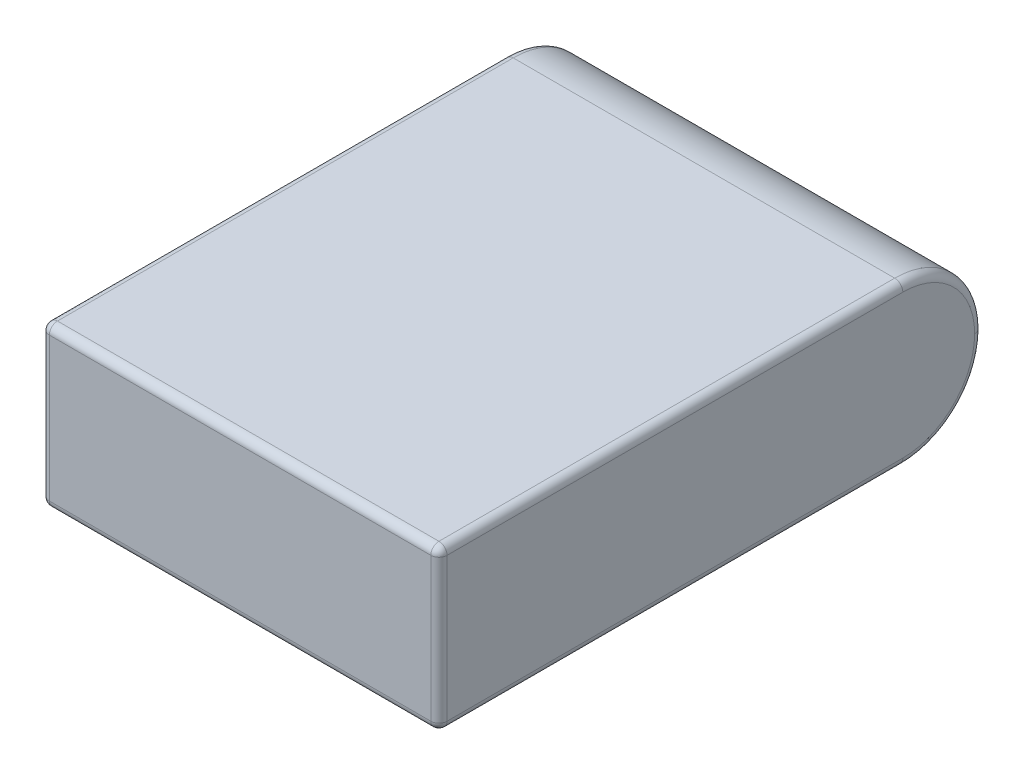
ISO-10303-21;
HEADER;
FILE_DESCRIPTION(('STEP AP214'),'2;1');
FILE_NAME('part.step','',(''),(''),'','','');
FILE_SCHEMA(('AUTOMOTIVE_DESIGN { 1 0 10303 214 1 1 1 1 }'));
ENDSEC;
DATA;
#1=APPLICATION_CONTEXT('core data for automotive mechanical design processes');
#2=APPLICATION_PROTOCOL_DEFINITION('international standard','automotive_design',2000,#1);
#3=PRODUCT_CONTEXT('',#1,'mechanical');
#4=PRODUCT('Part','Part','',(#3));
#5=PRODUCT_RELATED_PRODUCT_CATEGORY('part','',(#4));
#6=PRODUCT_DEFINITION_FORMATION('','',#4);
#7=PRODUCT_DEFINITION_CONTEXT('part definition',#1,'design');
#8=PRODUCT_DEFINITION('design','',#6,#7);
#9=PRODUCT_DEFINITION_SHAPE('','',#8);
#10=(LENGTH_UNIT() NAMED_UNIT(*) SI_UNIT(.MILLI.,.METRE.));
#11=(NAMED_UNIT(*) PLANE_ANGLE_UNIT() SI_UNIT($,.RADIAN.));
#12=(NAMED_UNIT(*) SI_UNIT($,.STERADIAN.) SOLID_ANGLE_UNIT());
#13=UNCERTAINTY_MEASURE_WITH_UNIT(LENGTH_MEASURE(1.E-05),#10,'distance_accuracy_value','');
#14=(GEOMETRIC_REPRESENTATION_CONTEXT(3) GLOBAL_UNCERTAINTY_ASSIGNED_CONTEXT((#13)) GLOBAL_UNIT_ASSIGNED_CONTEXT((#10,
#11,#12)) REPRESENTATION_CONTEXT('',''));
#15=CARTESIAN_POINT('',(0.,0.,0.));
#16=DIRECTION('',(0.,0.,1.));
#17=DIRECTION('',(1.,0.,0.));
#18=AXIS2_PLACEMENT_3D('',#15,#16,#17);
#19=CARTESIAN_POINT('',(24.5,-19.7,-33.5));
#20=DIRECTION('',(1.,0.,0.));
#21=DIRECTION('',(0.,0.,-1.));
#22=AXIS2_PLACEMENT_3D('',#19,#20,#21);
#23=PLANE('',#22);
#24=DIRECTION('',(0.,0.,-1.));
#25=VECTOR('',#24,1.);
#26=CARTESIAN_POINT('',(24.5,-1.,-33.5));
#27=LINE('',#26,#25);
#28=CARTESIAN_POINT('',(24.5,-1.,-23.65));
#29=VERTEX_POINT('',#28);
#30=CARTESIAN_POINT('',(24.5,-1.,32.5));
#31=VERTEX_POINT('',#30);
#32=EDGE_CURVE('E167',#29,#31,#27,.F.);
#33=ORIENTED_EDGE('',*,*,#32,.T.);
#34=DIRECTION('',(0.,1.,0.));
#35=VECTOR('',#34,1.);
#36=CARTESIAN_POINT('',(24.5,-19.7,32.5));
#37=LINE('',#36,#35);
#38=CARTESIAN_POINT('',(24.5,-18.7,32.5));
#39=VERTEX_POINT('',#38);
#40=EDGE_CURVE('E128',#31,#39,#37,.F.);
#41=ORIENTED_EDGE('',*,*,#40,.T.);
#42=DIRECTION('',(0.,0.,-1.));
#43=VECTOR('',#42,1.);
#44=CARTESIAN_POINT('',(24.5,-18.7,-23.65));
#45=LINE('',#44,#43);
#46=CARTESIAN_POINT('',(24.5,-18.7,-23.65));
#47=VERTEX_POINT('',#46);
#48=EDGE_CURVE('E158',#39,#47,#45,.T.);
#49=ORIENTED_EDGE('',*,*,#48,.T.);
#50=CARTESIAN_POINT('',(24.5,-9.85,-23.65));
#51=DIRECTION('',(1.,0.,0.));
#52=DIRECTION('',(0.,0.,-1.));
#53=AXIS2_PLACEMENT_3D('',#50,#51,#52);
#54=CIRCLE('',#53,8.85);
#55=CARTESIAN_POINT('',(24.5,-9.85,-32.5));
#56=VERTEX_POINT('',#55);
#57=EDGE_CURVE('E163',#47,#56,#54,.T.);
#58=ORIENTED_EDGE('',*,*,#57,.T.);
#59=CARTESIAN_POINT('',(24.5,-9.85,-23.65));
#60=DIRECTION('',(1.,0.,0.));
#61=DIRECTION('',(0.,0.,-1.));
#62=AXIS2_PLACEMENT_3D('',#59,#60,#61);
#63=CIRCLE('',#62,8.85);
#64=EDGE_CURVE('E165',#56,#29,#63,.T.);
#65=ORIENTED_EDGE('',*,*,#64,.T.);
#66=EDGE_LOOP('',(#33,#41,#49,#58,#65));
#67=FACE_BOUND('',#66,.T.);
#68=ADVANCED_FACE('F33',(#67),#23,.T.);
#69=CARTESIAN_POINT('',(-24.5,-19.7,33.5));
#70=DIRECTION('',(0.,0.,1.));
#71=DIRECTION('',(1.,0.,0.));
#72=AXIS2_PLACEMENT_3D('',#69,#70,#71);
#73=PLANE('',#72);
#74=DIRECTION('',(0.,1.,0.));
#75=VECTOR('',#74,1.);
#76=CARTESIAN_POINT('',(-23.5,-19.7,33.5));
#77=LINE('',#76,#75);
#78=CARTESIAN_POINT('',(-23.5,-1.,33.5));
#79=VERTEX_POINT('',#78);
#80=CARTESIAN_POINT('',(-23.5,-18.7,33.5));
#81=VERTEX_POINT('',#80);
#82=EDGE_CURVE('E150',#79,#81,#77,.F.);
#83=ORIENTED_EDGE('',*,*,#82,.T.);
#84=DIRECTION('',(1.,0.,0.));
#85=VECTOR('',#84,1.);
#86=CARTESIAN_POINT('',(24.5,-18.7,33.5));
#87=LINE('',#86,#85);
#88=CARTESIAN_POINT('',(23.5,-18.7,33.5));
#89=VERTEX_POINT('',#88);
#90=EDGE_CURVE('E155',#81,#89,#87,.T.);
#91=ORIENTED_EDGE('',*,*,#90,.T.);
#92=DIRECTION('',(0.,1.,0.));
#93=VECTOR('',#92,1.);
#94=CARTESIAN_POINT('',(23.5,-19.7,33.5));
#95=LINE('',#94,#93);
#96=CARTESIAN_POINT('',(23.5,-1.,33.5));
#97=VERTEX_POINT('',#96);
#98=EDGE_CURVE('E126',#89,#97,#95,.T.);
#99=ORIENTED_EDGE('',*,*,#98,.T.);
#100=DIRECTION('',(1.,0.,0.));
#101=VECTOR('',#100,1.);
#102=CARTESIAN_POINT('',(-24.5,-1.,33.5));
#103=LINE('',#102,#101);
#104=EDGE_CURVE('E144',#97,#79,#103,.F.);
#105=ORIENTED_EDGE('',*,*,#104,.T.);
#106=EDGE_LOOP('',(#83,#91,#99,#105));
#107=FACE_BOUND('',#106,.T.);
#108=ADVANCED_FACE('F153',(#107),#73,.T.);
#109=CARTESIAN_POINT('',(-24.5,-19.7,-33.5));
#110=DIRECTION('',(-1.,0.,0.));
#111=DIRECTION('',(0.,0.,1.));
#112=AXIS2_PLACEMENT_3D('',#109,#110,#111);
#113=PLANE('',#112);
#114=DIRECTION('',(0.,1.,0.));
#115=VECTOR('',#114,1.);
#116=CARTESIAN_POINT('',(-24.5,-19.7,32.5));
#117=LINE('',#116,#115);
#118=CARTESIAN_POINT('',(-24.5,-18.7,32.5));
#119=VERTEX_POINT('',#118);
#120=CARTESIAN_POINT('',(-24.5,-1.,32.5));
#121=VERTEX_POINT('',#120);
#122=EDGE_CURVE('E42',#119,#121,#117,.T.);
#123=ORIENTED_EDGE('',*,*,#122,.T.);
#124=DIRECTION('',(0.,0.,1.));
#125=VECTOR('',#124,1.);
#126=CARTESIAN_POINT('',(-24.5,-1.,-33.5));
#127=LINE('',#126,#125);
#128=CARTESIAN_POINT('',(-24.5,-1.,-23.65));
#129=VERTEX_POINT('',#128);
#130=EDGE_CURVE('E11',#121,#129,#127,.F.);
#131=ORIENTED_EDGE('',*,*,#130,.T.);
#132=CARTESIAN_POINT('',(-24.5,-9.85,-23.65));
#133=DIRECTION('',(-1.,0.,0.));
#134=DIRECTION('',(0.,0.,1.));
#135=AXIS2_PLACEMENT_3D('',#132,#133,#134);
#136=CIRCLE('',#135,8.85);
#137=CARTESIAN_POINT('',(-24.5,-9.85,-32.5));
#138=VERTEX_POINT('',#137);
#139=EDGE_CURVE('E191',#129,#138,#136,.T.);
#140=ORIENTED_EDGE('',*,*,#139,.T.);
#141=CARTESIAN_POINT('',(-24.5,-9.85,-23.65));
#142=DIRECTION('',(-1.,0.,0.));
#143=DIRECTION('',(0.,0.,1.));
#144=AXIS2_PLACEMENT_3D('',#141,#142,#143);
#145=CIRCLE('',#144,8.85);
#146=CARTESIAN_POINT('',(-24.5,-18.7,-23.65));
#147=VERTEX_POINT('',#146);
#148=EDGE_CURVE('E193',#138,#147,#145,.T.);
#149=ORIENTED_EDGE('',*,*,#148,.T.);
#150=DIRECTION('',(0.,0.,1.));
#151=VECTOR('',#150,1.);
#152=CARTESIAN_POINT('',(-24.5,-18.7,33.5));
#153=LINE('',#152,#151);
#154=EDGE_CURVE('E53',#147,#119,#153,.T.);
#155=ORIENTED_EDGE('',*,*,#154,.T.);
#156=EDGE_LOOP('',(#123,#131,#140,#149,#155));
#157=FACE_BOUND('',#156,.T.);
#158=ADVANCED_FACE('F277',(#157),#113,.T.);
#159=CARTESIAN_POINT('',(24.5,-19.7,33.5));
#160=DIRECTION('',(0.,1.,0.));
#161=DIRECTION('',(0.,0.,1.));
#162=AXIS2_PLACEMENT_3D('',#159,#160,#161);
#163=PLANE('',#162);
#164=DIRECTION('',(-1.,0.,0.));
#165=VECTOR('',#164,1.);
#166=CARTESIAN_POINT('',(24.5,-19.7,-23.65));
#167=LINE('',#166,#165);
#168=CARTESIAN_POINT('',(-23.5,-19.7,-23.65));
#169=VERTEX_POINT('',#168);
#170=CARTESIAN_POINT('',(23.5,-19.7,-23.65));
#171=VERTEX_POINT('',#170);
#172=EDGE_CURVE('E241',#169,#171,#167,.F.);
#173=ORIENTED_EDGE('',*,*,#172,.T.);
#174=DIRECTION('',(0.,0.,-1.));
#175=VECTOR('',#174,1.);
#176=CARTESIAN_POINT('',(23.5,-19.7,33.5));
#177=LINE('',#176,#175);
#178=CARTESIAN_POINT('',(23.5,-19.7,32.5));
#179=VERTEX_POINT('',#178);
#180=EDGE_CURVE('E189',#171,#179,#177,.F.);
#181=ORIENTED_EDGE('',*,*,#180,.T.);
#182=DIRECTION('',(1.,0.,0.));
#183=VECTOR('',#182,1.);
#184=CARTESIAN_POINT('',(-24.5,-19.7,32.5));
#185=LINE('',#184,#183);
#186=CARTESIAN_POINT('',(-23.5,-19.7,32.5));
#187=VERTEX_POINT('',#186);
#188=EDGE_CURVE('E185',#179,#187,#185,.F.);
#189=ORIENTED_EDGE('',*,*,#188,.T.);
#190=DIRECTION('',(0.,0.,1.));
#191=VECTOR('',#190,1.);
#192=CARTESIAN_POINT('',(-23.5,-19.7,-23.65));
#193=LINE('',#192,#191);
#194=EDGE_CURVE('E187',#187,#169,#193,.F.);
#195=ORIENTED_EDGE('',*,*,#194,.T.);
#196=EDGE_LOOP('',(#173,#181,#189,#195));
#197=FACE_BOUND('',#196,.T.);
#198=ADVANCED_FACE('F279',(#197),#163,.F.);
#199=CARTESIAN_POINT('',(24.5,0.,33.5));
#200=DIRECTION('',(0.,1.,0.));
#201=DIRECTION('',(0.,0.,1.));
#202=AXIS2_PLACEMENT_3D('',#199,#200,#201);
#203=PLANE('',#202);
#204=DIRECTION('',(1.,0.,0.));
#205=VECTOR('',#204,1.);
#206=CARTESIAN_POINT('',(24.5,0.,32.5));
#207=LINE('',#206,#205);
#208=CARTESIAN_POINT('',(-23.5,0.,32.5));
#209=VERTEX_POINT('',#208);
#210=CARTESIAN_POINT('',(23.5,0.,32.5));
#211=VERTEX_POINT('',#210);
#212=EDGE_CURVE('E170',#209,#211,#207,.T.);
#213=ORIENTED_EDGE('',*,*,#212,.T.);
#214=DIRECTION('',(0.,0.,-1.));
#215=VECTOR('',#214,1.);
#216=CARTESIAN_POINT('',(23.5,0.,33.5));
#217=LINE('',#216,#215);
#218=CARTESIAN_POINT('',(23.5,0.,-23.65));
#219=VERTEX_POINT('',#218);
#220=EDGE_CURVE('E174',#211,#219,#217,.T.);
#221=ORIENTED_EDGE('',*,*,#220,.T.);
#222=DIRECTION('',(-1.,0.,0.));
#223=VECTOR('',#222,1.);
#224=CARTESIAN_POINT('',(24.5,0.,-23.65));
#225=LINE('',#224,#223);
#226=CARTESIAN_POINT('',(-23.5,0.,-23.65));
#227=VERTEX_POINT('',#226);
#228=EDGE_CURVE('E151',#219,#227,#225,.T.);
#229=ORIENTED_EDGE('',*,*,#228,.T.);
#230=DIRECTION('',(0.,0.,1.));
#231=VECTOR('',#230,1.);
#232=CARTESIAN_POINT('',(-23.5,0.,33.5));
#233=LINE('',#232,#231);
#234=EDGE_CURVE('E172',#227,#209,#233,.T.);
#235=ORIENTED_EDGE('',*,*,#234,.T.);
#236=EDGE_LOOP('',(#213,#221,#229,#235));
#237=FACE_BOUND('',#236,.T.);
#238=ADVANCED_FACE('F253',(#237),#203,.T.);
#239=CARTESIAN_POINT('',(24.5,-9.85,-23.65));
#240=DIRECTION('',(-1.,0.,0.));
#241=DIRECTION('',(0.,0.,1.));
#242=AXIS2_PLACEMENT_3D('',#239,#240,#241);
#243=CYLINDRICAL_SURFACE('',#242,9.85);
#244=ORIENTED_EDGE('',*,*,#228,.F.);
#245=CARTESIAN_POINT('',(23.5,-9.85,-23.65));
#246=DIRECTION('',(1.,0.,0.));
#247=DIRECTION('',(0.,0.,-1.));
#248=AXIS2_PLACEMENT_3D('',#245,#246,#247);
#249=CIRCLE('',#248,9.85);
#250=CARTESIAN_POINT('',(23.5,-9.85,-33.5));
#251=VERTEX_POINT('',#250);
#252=EDGE_CURVE('E179',#219,#251,#249,.F.);
#253=ORIENTED_EDGE('',*,*,#252,.T.);
#254=DIRECTION('',(-1.,0.,0.));
#255=VECTOR('',#254,1.);
#256=CARTESIAN_POINT('',(-24.5,-9.85,-33.5));
#257=LINE('',#256,#255);
#258=CARTESIAN_POINT('',(-23.5,-9.85,-33.5));
#259=VERTEX_POINT('',#258);
#260=EDGE_CURVE('E235',#259,#251,#257,.F.);
#261=ORIENTED_EDGE('',*,*,#260,.F.);
#262=CARTESIAN_POINT('',(-23.5,-9.85,-23.65));
#263=DIRECTION('',(-1.,0.,0.));
#264=DIRECTION('',(0.,0.,1.));
#265=AXIS2_PLACEMENT_3D('',#262,#263,#264);
#266=CIRCLE('',#265,9.85);
#267=EDGE_CURVE('E177',#259,#227,#266,.F.);
#268=ORIENTED_EDGE('',*,*,#267,.T.);
#269=EDGE_LOOP('',(#244,#253,#261,#268));
#270=FACE_BOUND('',#269,.T.);
#271=ADVANCED_FACE('F273',(#270),#243,.T.);
#272=CARTESIAN_POINT('',(-24.5,-9.85,-23.65));
#273=DIRECTION('',(1.,0.,0.));
#274=DIRECTION('',(0.,0.,-1.));
#275=AXIS2_PLACEMENT_3D('',#272,#273,#274);
#276=CYLINDRICAL_SURFACE('',#275,9.85);
#277=ORIENTED_EDGE('',*,*,#260,.T.);
#278=CARTESIAN_POINT('',(23.5,-9.85,-23.65));
#279=DIRECTION('',(1.,0.,0.));
#280=DIRECTION('',(0.,0.,-1.));
#281=AXIS2_PLACEMENT_3D('',#278,#279,#280);
#282=CIRCLE('',#281,9.85);
#283=EDGE_CURVE('E183',#251,#171,#282,.F.);
#284=ORIENTED_EDGE('',*,*,#283,.T.);
#285=ORIENTED_EDGE('',*,*,#172,.F.);
#286=CARTESIAN_POINT('',(-23.5,-9.85,-23.65));
#287=DIRECTION('',(-1.,0.,0.));
#288=DIRECTION('',(0.,0.,1.));
#289=AXIS2_PLACEMENT_3D('',#286,#287,#288);
#290=CIRCLE('',#289,9.85);
#291=EDGE_CURVE('E181',#169,#259,#290,.F.);
#292=ORIENTED_EDGE('',*,*,#291,.T.);
#293=EDGE_LOOP('',(#277,#284,#285,#292));
#294=FACE_BOUND('',#293,.T.);
#295=ADVANCED_FACE('F294',(#294),#276,.T.);
#296=CARTESIAN_POINT('',(-23.5,-9.85,-23.65));
#297=DIRECTION('',(-1.,0.,0.));
#298=DIRECTION('',(0.,0.,1.));
#299=AXIS2_PLACEMENT_3D('',#296,#297,#298);
#300=TOROIDAL_SURFACE('',#299,8.85,1.);
#301=CARTESIAN_POINT('',(-23.5,-18.7,-23.65));
#302=DIRECTION('',(0.,0.,1.));
#303=DIRECTION('',(1.,0.,0.));
#304=AXIS2_PLACEMENT_3D('',#301,#302,#303);
#305=CIRCLE('',#304,1.);
#306=EDGE_CURVE('E229',#147,#169,#305,.T.);
#307=ORIENTED_EDGE('',*,*,#306,.F.);
#308=ORIENTED_EDGE('',*,*,#148,.F.);
#309=CARTESIAN_POINT('',(-23.5,-9.85,-32.5));
#310=DIRECTION('',(0.,1.,0.));
#311=DIRECTION('',(0.,0.,1.));
#312=AXIS2_PLACEMENT_3D('',#309,#310,#311);
#313=CIRCLE('',#312,1.);
#314=EDGE_CURVE('E37',#259,#138,#313,.T.);
#315=ORIENTED_EDGE('',*,*,#314,.F.);
#316=ORIENTED_EDGE('',*,*,#291,.F.);
#317=EDGE_LOOP('',(#307,#308,#315,#316));
#318=FACE_BOUND('',#317,.T.);
#319=ADVANCED_FACE('F35',(#318),#300,.T.);
#320=CARTESIAN_POINT('',(-23.5,-9.85,-23.65));
#321=DIRECTION('',(-1.,0.,0.));
#322=DIRECTION('',(0.,0.,1.));
#323=AXIS2_PLACEMENT_3D('',#320,#321,#322);
#324=TOROIDAL_SURFACE('',#323,8.85,1.);
#325=ORIENTED_EDGE('',*,*,#314,.T.);
#326=ORIENTED_EDGE('',*,*,#139,.F.);
#327=CARTESIAN_POINT('',(-23.5,-1.,-23.65));
#328=DIRECTION('',(0.,0.,1.));
#329=DIRECTION('',(1.,0.,0.));
#330=AXIS2_PLACEMENT_3D('',#327,#328,#329);
#331=CIRCLE('',#330,1.);
#332=EDGE_CURVE('E228',#227,#129,#331,.T.);
#333=ORIENTED_EDGE('',*,*,#332,.F.);
#334=ORIENTED_EDGE('',*,*,#267,.F.);
#335=EDGE_LOOP('',(#325,#326,#333,#334));
#336=FACE_BOUND('',#335,.T.);
#337=ADVANCED_FACE('F258',(#336),#324,.T.);
#338=CARTESIAN_POINT('',(-23.5,-18.7,-33.5));
#339=DIRECTION('',(0.,0.,-1.));
#340=DIRECTION('',(-1.,0.,0.));
#341=AXIS2_PLACEMENT_3D('',#338,#339,#340);
#342=CYLINDRICAL_SURFACE('',#341,1.);
#343=ORIENTED_EDGE('',*,*,#306,.T.);
#344=ORIENTED_EDGE('',*,*,#194,.F.);
#345=CARTESIAN_POINT('',(-23.5,-18.7,32.5));
#346=DIRECTION('',(0.,0.,1.));
#347=DIRECTION('',(1.,0.,0.));
#348=AXIS2_PLACEMENT_3D('',#345,#346,#347);
#349=CIRCLE('',#348,1.);
#350=EDGE_CURVE('E225',#119,#187,#349,.T.);
#351=ORIENTED_EDGE('',*,*,#350,.F.);
#352=ORIENTED_EDGE('',*,*,#154,.F.);
#353=EDGE_LOOP('',(#343,#344,#351,#352));
#354=FACE_BOUND('',#353,.T.);
#355=ADVANCED_FACE('F336',(#354),#342,.T.);
#356=CARTESIAN_POINT('',(-23.5,-19.7,32.5));
#357=DIRECTION('',(0.,1.,0.));
#358=DIRECTION('',(0.,0.,1.));
#359=AXIS2_PLACEMENT_3D('',#356,#357,#358);
#360=CYLINDRICAL_SURFACE('',#359,1.);
#361=CARTESIAN_POINT('',(-23.5,-1.,32.5));
#362=DIRECTION('',(0.,1.,0.));
#363=DIRECTION('',(0.,0.,1.));
#364=AXIS2_PLACEMENT_3D('',#361,#362,#363);
#365=CIRCLE('',#364,1.);
#366=EDGE_CURVE('E219',#121,#79,#365,.T.);
#367=ORIENTED_EDGE('',*,*,#366,.F.);
#368=ORIENTED_EDGE('',*,*,#122,.F.);
#369=CARTESIAN_POINT('',(-23.5,-18.7,32.5));
#370=DIRECTION('',(0.,-1.,0.));
#371=DIRECTION('',(0.,0.,-1.));
#372=AXIS2_PLACEMENT_3D('',#369,#370,#371);
#373=CIRCLE('',#372,1.);
#374=EDGE_CURVE('E222',#81,#119,#373,.T.);
#375=ORIENTED_EDGE('',*,*,#374,.F.);
#376=ORIENTED_EDGE('',*,*,#82,.F.);
#377=EDGE_LOOP('',(#367,#368,#375,#376));
#378=FACE_BOUND('',#377,.T.);
#379=ADVANCED_FACE('F333',(#378),#360,.T.);
#380=CARTESIAN_POINT('',(-23.5,-1.,33.5));
#381=DIRECTION('',(0.,0.,1.));
#382=DIRECTION('',(1.,0.,0.));
#383=AXIS2_PLACEMENT_3D('',#380,#381,#382);
#384=CYLINDRICAL_SURFACE('',#383,1.);
#385=ORIENTED_EDGE('',*,*,#332,.T.);
#386=ORIENTED_EDGE('',*,*,#130,.F.);
#387=CARTESIAN_POINT('',(-23.5,-1.,32.5));
#388=DIRECTION('',(0.,0.,1.));
#389=DIRECTION('',(1.,0.,0.));
#390=AXIS2_PLACEMENT_3D('',#387,#388,#389);
#391=CIRCLE('',#390,1.);
#392=EDGE_CURVE('E216',#209,#121,#391,.T.);
#393=ORIENTED_EDGE('',*,*,#392,.F.);
#394=ORIENTED_EDGE('',*,*,#234,.F.);
#395=EDGE_LOOP('',(#385,#386,#393,#394));
#396=FACE_BOUND('',#395,.T.);
#397=ADVANCED_FACE('F260',(#396),#384,.T.);
#398=CARTESIAN_POINT('',(23.5,-9.85,-23.65));
#399=DIRECTION('',(1.,0.,0.));
#400=DIRECTION('',(0.,0.,-1.));
#401=AXIS2_PLACEMENT_3D('',#398,#399,#400);
#402=TOROIDAL_SURFACE('',#401,8.85,1.);
#403=CARTESIAN_POINT('',(23.5,-18.7,-23.65));
#404=DIRECTION('',(0.,0.,1.));
#405=DIRECTION('',(1.,0.,0.));
#406=AXIS2_PLACEMENT_3D('',#403,#404,#405);
#407=CIRCLE('',#406,1.);
#408=EDGE_CURVE('E210',#171,#47,#407,.T.);
#409=ORIENTED_EDGE('',*,*,#408,.F.);
#410=ORIENTED_EDGE('',*,*,#283,.F.);
#411=CARTESIAN_POINT('',(23.5,-9.85,-32.5));
#412=DIRECTION('',(0.,1.,0.));
#413=DIRECTION('',(0.,0.,1.));
#414=AXIS2_PLACEMENT_3D('',#411,#412,#413);
#415=CIRCLE('',#414,1.);
#416=EDGE_CURVE('E213',#56,#251,#415,.T.);
#417=ORIENTED_EDGE('',*,*,#416,.F.);
#418=ORIENTED_EDGE('',*,*,#57,.F.);
#419=EDGE_LOOP('',(#409,#410,#417,#418));
#420=FACE_BOUND('',#419,.T.);
#421=ADVANCED_FACE('F326',(#420),#402,.T.);
#422=CARTESIAN_POINT('',(-23.5,-18.7,32.5));
#423=DIRECTION('',(0.,0.,1.));
#424=DIRECTION('',(1.,0.,0.));
#425=AXIS2_PLACEMENT_3D('',#422,#423,#424);
#426=SPHERICAL_SURFACE('',#425,1.);
#427=ORIENTED_EDGE('',*,*,#374,.T.);
#428=ORIENTED_EDGE('',*,*,#350,.T.);
#429=CARTESIAN_POINT('',(-23.5,-18.7,32.5));
#430=DIRECTION('',(-1.,0.,0.));
#431=DIRECTION('',(0.,0.,1.));
#432=AXIS2_PLACEMENT_3D('',#429,#430,#431);
#433=CIRCLE('',#432,1.);
#434=EDGE_CURVE('E207',#81,#187,#433,.F.);
#435=ORIENTED_EDGE('',*,*,#434,.F.);
#436=EDGE_LOOP('',(#427,#428,#435));
#437=FACE_BOUND('',#436,.T.);
#438=ADVANCED_FACE('F323',(#437),#426,.T.);
#439=CARTESIAN_POINT('',(-23.5,-1.,32.5));
#440=DIRECTION('',(0.,0.,1.));
#441=DIRECTION('',(1.,0.,0.));
#442=AXIS2_PLACEMENT_3D('',#439,#440,#441);
#443=SPHERICAL_SURFACE('',#442,1.);
#444=ORIENTED_EDGE('',*,*,#392,.T.);
#445=ORIENTED_EDGE('',*,*,#366,.T.);
#446=CARTESIAN_POINT('',(-23.5,-1.,32.5));
#447=DIRECTION('',(-1.,0.,0.));
#448=DIRECTION('',(0.,0.,1.));
#449=AXIS2_PLACEMENT_3D('',#446,#447,#448);
#450=CIRCLE('',#449,1.);
#451=EDGE_CURVE('E147',#209,#79,#450,.F.);
#452=ORIENTED_EDGE('',*,*,#451,.F.);
#453=EDGE_LOOP('',(#444,#445,#452));
#454=FACE_BOUND('',#453,.T.);
#455=ADVANCED_FACE('F263',(#454),#443,.T.);
#456=CARTESIAN_POINT('',(23.5,-9.85,-23.65));
#457=DIRECTION('',(1.,0.,0.));
#458=DIRECTION('',(0.,0.,-1.));
#459=AXIS2_PLACEMENT_3D('',#456,#457,#458);
#460=TOROIDAL_SURFACE('',#459,8.85,1.);
#461=ORIENTED_EDGE('',*,*,#416,.T.);
#462=ORIENTED_EDGE('',*,*,#252,.F.);
#463=CARTESIAN_POINT('',(23.5,-1.,-23.65));
#464=DIRECTION('',(0.,0.,1.));
#465=DIRECTION('',(1.,0.,0.));
#466=AXIS2_PLACEMENT_3D('',#463,#464,#465);
#467=CIRCLE('',#466,1.);
#468=EDGE_CURVE('E204',#29,#219,#467,.T.);
#469=ORIENTED_EDGE('',*,*,#468,.F.);
#470=ORIENTED_EDGE('',*,*,#64,.F.);
#471=EDGE_LOOP('',(#461,#462,#469,#470));
#472=FACE_BOUND('',#471,.T.);
#473=ADVANCED_FACE('F271',(#472),#460,.T.);
#474=CARTESIAN_POINT('',(23.5,-18.7,-33.5));
#475=DIRECTION('',(0.,0.,1.));
#476=DIRECTION('',(1.,0.,0.));
#477=AXIS2_PLACEMENT_3D('',#474,#475,#476);
#478=CYLINDRICAL_SURFACE('',#477,1.);
#479=ORIENTED_EDGE('',*,*,#408,.T.);
#480=ORIENTED_EDGE('',*,*,#48,.F.);
#481=CARTESIAN_POINT('',(23.5,-18.7,32.5));
#482=DIRECTION('',(0.,0.,1.));
#483=DIRECTION('',(1.,0.,0.));
#484=AXIS2_PLACEMENT_3D('',#481,#482,#483);
#485=CIRCLE('',#484,1.);
#486=EDGE_CURVE('E201',#179,#39,#485,.T.);
#487=ORIENTED_EDGE('',*,*,#486,.F.);
#488=ORIENTED_EDGE('',*,*,#180,.F.);
#489=EDGE_LOOP('',(#479,#480,#487,#488));
#490=FACE_BOUND('',#489,.T.);
#491=ADVANCED_FACE('F314',(#490),#478,.T.);
#492=CARTESIAN_POINT('',(-24.5,-18.7,32.5));
#493=DIRECTION('',(-1.,0.,0.));
#494=DIRECTION('',(0.,0.,1.));
#495=AXIS2_PLACEMENT_3D('',#492,#493,#494);
#496=CYLINDRICAL_SURFACE('',#495,1.);
#497=ORIENTED_EDGE('',*,*,#434,.T.);
#498=ORIENTED_EDGE('',*,*,#188,.F.);
#499=CARTESIAN_POINT('',(23.5,-18.7,32.5));
#500=DIRECTION('',(1.,0.,0.));
#501=DIRECTION('',(0.,0.,-1.));
#502=AXIS2_PLACEMENT_3D('',#499,#500,#501);
#503=CIRCLE('',#502,1.);
#504=EDGE_CURVE('E141',#89,#179,#503,.T.);
#505=ORIENTED_EDGE('',*,*,#504,.F.);
#506=ORIENTED_EDGE('',*,*,#90,.F.);
#507=EDGE_LOOP('',(#497,#498,#505,#506));
#508=FACE_BOUND('',#507,.T.);
#509=ADVANCED_FACE('F311',(#508),#496,.T.);
#510=CARTESIAN_POINT('',(24.5,-1.,32.5));
#511=DIRECTION('',(1.,0.,0.));
#512=DIRECTION('',(0.,0.,-1.));
#513=AXIS2_PLACEMENT_3D('',#510,#511,#512);
#514=CYLINDRICAL_SURFACE('',#513,1.);
#515=ORIENTED_EDGE('',*,*,#451,.T.);
#516=ORIENTED_EDGE('',*,*,#104,.F.);
#517=CARTESIAN_POINT('',(23.5,-1.,32.5));
#518=DIRECTION('',(1.,0.,0.));
#519=DIRECTION('',(0.,0.,-1.));
#520=AXIS2_PLACEMENT_3D('',#517,#518,#519);
#521=CIRCLE('',#520,1.);
#522=EDGE_CURVE('E134',#211,#97,#521,.T.);
#523=ORIENTED_EDGE('',*,*,#522,.F.);
#524=ORIENTED_EDGE('',*,*,#212,.F.);
#525=EDGE_LOOP('',(#515,#516,#523,#524));
#526=FACE_BOUND('',#525,.T.);
#527=ADVANCED_FACE('F145',(#526),#514,.T.);
#528=CARTESIAN_POINT('',(23.5,-1.,33.5));
#529=DIRECTION('',(0.,0.,-1.));
#530=DIRECTION('',(-1.,0.,0.));
#531=AXIS2_PLACEMENT_3D('',#528,#529,#530);
#532=CYLINDRICAL_SURFACE('',#531,1.);
#533=ORIENTED_EDGE('',*,*,#468,.T.);
#534=ORIENTED_EDGE('',*,*,#220,.F.);
#535=CARTESIAN_POINT('',(23.5,-1.,32.5));
#536=DIRECTION('',(0.,0.,1.));
#537=DIRECTION('',(1.,0.,0.));
#538=AXIS2_PLACEMENT_3D('',#535,#536,#537);
#539=CIRCLE('',#538,1.);
#540=EDGE_CURVE('E138',#31,#211,#539,.T.);
#541=ORIENTED_EDGE('',*,*,#540,.F.);
#542=ORIENTED_EDGE('',*,*,#32,.F.);
#543=EDGE_LOOP('',(#533,#534,#541,#542));
#544=FACE_BOUND('',#543,.T.);
#545=ADVANCED_FACE('F265',(#544),#532,.T.);
#546=CARTESIAN_POINT('',(23.5,-18.7,32.5));
#547=DIRECTION('',(0.,0.,1.));
#548=DIRECTION('',(1.,0.,0.));
#549=AXIS2_PLACEMENT_3D('',#546,#547,#548);
#550=SPHERICAL_SURFACE('',#549,1.);
#551=ORIENTED_EDGE('',*,*,#504,.T.);
#552=ORIENTED_EDGE('',*,*,#486,.T.);
#553=CARTESIAN_POINT('',(23.5,-18.7,32.5));
#554=DIRECTION('',(0.,-1.,0.));
#555=DIRECTION('',(0.,0.,-1.));
#556=AXIS2_PLACEMENT_3D('',#553,#554,#555);
#557=CIRCLE('',#556,1.);
#558=EDGE_CURVE('E131',#89,#39,#557,.F.);
#559=ORIENTED_EDGE('',*,*,#558,.F.);
#560=EDGE_LOOP('',(#551,#552,#559));
#561=FACE_BOUND('',#560,.T.);
#562=ADVANCED_FACE('F303',(#561),#550,.T.);
#563=CARTESIAN_POINT('',(23.5,-1.,32.5));
#564=DIRECTION('',(0.,0.,1.));
#565=DIRECTION('',(1.,0.,0.));
#566=AXIS2_PLACEMENT_3D('',#563,#564,#565);
#567=SPHERICAL_SURFACE('',#566,1.);
#568=ORIENTED_EDGE('',*,*,#540,.T.);
#569=ORIENTED_EDGE('',*,*,#522,.T.);
#570=CARTESIAN_POINT('',(23.5,-1.,32.5));
#571=DIRECTION('',(0.,1.,0.));
#572=DIRECTION('',(0.,0.,1.));
#573=AXIS2_PLACEMENT_3D('',#570,#571,#572);
#574=CIRCLE('',#573,1.);
#575=EDGE_CURVE('E122',#31,#97,#574,.F.);
#576=ORIENTED_EDGE('',*,*,#575,.F.);
#577=EDGE_LOOP('',(#568,#569,#576));
#578=FACE_BOUND('',#577,.T.);
#579=ADVANCED_FACE('F136',(#578),#567,.T.);
#580=CARTESIAN_POINT('',(23.5,-19.7,32.5));
#581=DIRECTION('',(0.,1.,0.));
#582=DIRECTION('',(0.,0.,1.));
#583=AXIS2_PLACEMENT_3D('',#580,#581,#582);
#584=CYLINDRICAL_SURFACE('',#583,1.);
#585=ORIENTED_EDGE('',*,*,#558,.T.);
#586=ORIENTED_EDGE('',*,*,#40,.F.);
#587=ORIENTED_EDGE('',*,*,#575,.T.);
#588=ORIENTED_EDGE('',*,*,#98,.F.);
#589=EDGE_LOOP('',(#585,#586,#587,#588));
#590=FACE_BOUND('',#589,.T.);
#591=ADVANCED_FACE('F124',(#590),#584,.T.);
#592=CLOSED_SHELL('',(#68,#108,#158,#198,#238,#271,#295,#319,#337,#355,#379,#397,#421,#438,#455,
#473,#491,#509,#527,#545,#562,#579,#591));
#593=MANIFOLD_SOLID_BREP('B2',#592);
#594=ADVANCED_BREP_SHAPE_REPRESENTATION('',(#18,#593),#14);
#595=SHAPE_DEFINITION_REPRESENTATION(#9,#594);
ENDSEC;
END-ISO-10303-21;
